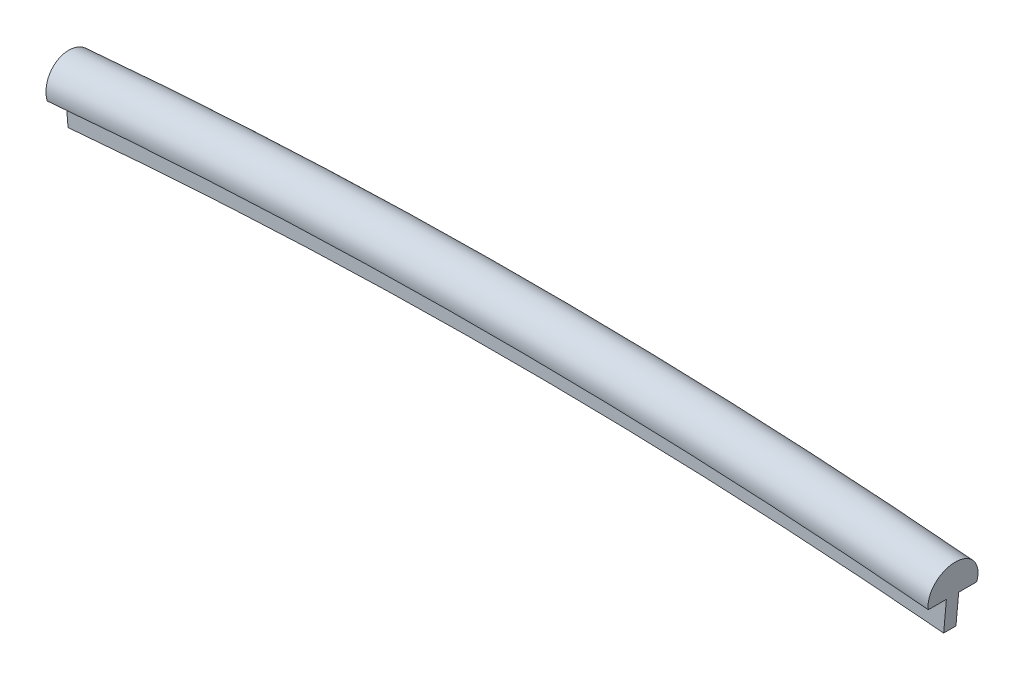
ISO-10303-21;
HEADER;
FILE_DESCRIPTION(('STEP AP214'),'2;1');
FILE_NAME('part.step','',(''),(''),'','','');
FILE_SCHEMA(('AUTOMOTIVE_DESIGN { 1 0 10303 214 1 1 1 1 }'));
ENDSEC;
DATA;
#1=APPLICATION_CONTEXT('core data for automotive mechanical design processes');
#2=APPLICATION_PROTOCOL_DEFINITION('international standard','automotive_design',2000,#1);
#3=PRODUCT_CONTEXT('',#1,'mechanical');
#4=PRODUCT('Part','Part','',(#3));
#5=PRODUCT_RELATED_PRODUCT_CATEGORY('part','',(#4));
#6=PRODUCT_DEFINITION_FORMATION('','',#4);
#7=PRODUCT_DEFINITION_CONTEXT('part definition',#1,'design');
#8=PRODUCT_DEFINITION('design','',#6,#7);
#9=PRODUCT_DEFINITION_SHAPE('','',#8);
#10=(LENGTH_UNIT() NAMED_UNIT(*) SI_UNIT(.MILLI.,.METRE.));
#11=(NAMED_UNIT(*) PLANE_ANGLE_UNIT() SI_UNIT($,.RADIAN.));
#12=(NAMED_UNIT(*) SI_UNIT($,.STERADIAN.) SOLID_ANGLE_UNIT());
#13=UNCERTAINTY_MEASURE_WITH_UNIT(LENGTH_MEASURE(1.E-05),#10,'distance_accuracy_value','');
#14=(GEOMETRIC_REPRESENTATION_CONTEXT(3) GLOBAL_UNCERTAINTY_ASSIGNED_CONTEXT((#13)) GLOBAL_UNIT_ASSIGNED_CONTEXT((#10,
#11,#12)) REPRESENTATION_CONTEXT('',''));
#15=CARTESIAN_POINT('',(0.,0.,0.));
#16=DIRECTION('',(0.,0.,1.));
#17=DIRECTION('',(1.,0.,0.));
#18=AXIS2_PLACEMENT_3D('',#15,#16,#17);
#19=CARTESIAN_POINT('',(0.,0.,70.5976415970385));
#20=DIRECTION('',(0.,0.,1.));
#21=DIRECTION('',(1.,0.,0.));
#22=AXIS2_PLACEMENT_3D('',#19,#20,#21);
#23=CYLINDRICAL_SURFACE('',#22,241.3);
#24=CARTESIAN_POINT('',(0.,0.,1.18));
#25=DIRECTION('',(0.,0.,1.));
#26=DIRECTION('',(1.,0.,0.));
#27=AXIS2_PLACEMENT_3D('',#24,#25,#26);
#28=CIRCLE('',#27,241.3);
#29=CARTESIAN_POINT('',(21.5114225884629,240.339236701419,1.18));
#30=VERTEX_POINT('',#29);
#31=CARTESIAN_POINT('',(-21.5114225884629,240.339236701419,1.18));
#32=VERTEX_POINT('',#31);
#33=EDGE_CURVE('E11',#30,#32,#28,.T.);
#34=ORIENTED_EDGE('',*,*,#33,.T.);
#35=DIRECTION('',(0.,0.,-1.));
#36=VECTOR('',#35,1.);
#37=CARTESIAN_POINT('',(-21.5114225884629,240.339236701419,1.18));
#38=LINE('',#37,#36);
#39=CARTESIAN_POINT('',(-21.5114225884629,240.339236701419,0.3));
#40=VERTEX_POINT('',#39);
#41=EDGE_CURVE('E103',#32,#40,#38,.T.);
#42=ORIENTED_EDGE('',*,*,#41,.T.);
#43=CARTESIAN_POINT('',(0.,0.,0.299999999999995));
#44=DIRECTION('',(0.,0.,1.));
#45=DIRECTION('',(1.,0.,0.));
#46=AXIS2_PLACEMENT_3D('',#43,#44,#45);
#47=CIRCLE('',#46,241.3);
#48=CARTESIAN_POINT('',(21.5114225884629,240.339236701419,0.3));
#49=VERTEX_POINT('',#48);
#50=EDGE_CURVE('E85',#49,#40,#47,.T.);
#51=ORIENTED_EDGE('',*,*,#50,.F.);
#52=DIRECTION('',(0.,0.,-1.));
#53=VECTOR('',#52,1.);
#54=CARTESIAN_POINT('',(21.5114225884629,240.339236701419,1.18));
#55=LINE('',#54,#53);
#56=EDGE_CURVE('E117',#30,#49,#55,.T.);
#57=ORIENTED_EDGE('',*,*,#56,.F.);
#58=EDGE_LOOP('',(#34,#42,#51,#57));
#59=FACE_BOUND('',#58,.T.);
#60=ADVANCED_FACE('F33',(#59),#23,.F.);
#61=CARTESIAN_POINT('',(0.,0.,0.));
#62=DIRECTION('',(0.,0.,1.));
#63=DIRECTION('',(1.,0.,0.));
#64=AXIS2_PLACEMENT_3D('',#61,#62,#63);
#65=TOROIDAL_SURFACE('',#64,241.586013989906,1.21416802890791);
#66=CARTESIAN_POINT('',(0.,0.,-1.18));
#67=DIRECTION('',(0.,0.,1.));
#68=DIRECTION('',(1.,0.,0.));
#69=AXIS2_PLACEMENT_3D('',#66,#67,#68);
#70=CIRCLE('',#69,241.3);
#71=CARTESIAN_POINT('',(21.5114225884629,240.339236701419,-1.18));
#72=VERTEX_POINT('',#71);
#73=CARTESIAN_POINT('',(-21.5114225884629,240.339236701419,-1.18));
#74=VERTEX_POINT('',#73);
#75=EDGE_CURVE('E41',#72,#74,#70,.T.);
#76=ORIENTED_EDGE('',*,*,#75,.T.);
#77=CARTESIAN_POINT('',(-21.5369201757115,240.624111894208,0.));
#78=DIRECTION('',(0.996018386661495,0.0891480422232197,0.));
#79=DIRECTION('',(0.,0.,1.));
#80=AXIS2_PLACEMENT_3D('',#77,#78,#79);
#81=CIRCLE('',#80,1.21416802890791);
#82=EDGE_CURVE('E115',#74,#32,#81,.T.);
#83=ORIENTED_EDGE('',*,*,#82,.T.);
#84=ORIENTED_EDGE('',*,*,#33,.F.);
#85=CARTESIAN_POINT('',(21.5369201757115,240.624111894208,0.));
#86=DIRECTION('',(0.996018386661495,-0.0891480422232197,0.));
#87=DIRECTION('',(0.,0.,1.));
#88=AXIS2_PLACEMENT_3D('',#85,#86,#87);
#89=CIRCLE('',#88,1.21416802890791);
#90=EDGE_CURVE('E97',#72,#30,#89,.T.);
#91=ORIENTED_EDGE('',*,*,#90,.F.);
#92=EDGE_LOOP('',(#76,#83,#84,#91));
#93=FACE_BOUND('',#92,.T.);
#94=ADVANCED_FACE('F35',(#93),#65,.T.);
#95=CARTESIAN_POINT('',(0.,0.,70.5976415970385));
#96=DIRECTION('',(0.,0.,1.));
#97=DIRECTION('',(1.,0.,0.));
#98=AXIS2_PLACEMENT_3D('',#95,#96,#97);
#99=CYLINDRICAL_SURFACE('',#98,241.3);
#100=CARTESIAN_POINT('',(0.,0.,-0.299999999999995));
#101=DIRECTION('',(0.,0.,1.));
#102=DIRECTION('',(1.,0.,0.));
#103=AXIS2_PLACEMENT_3D('',#100,#101,#102);
#104=CIRCLE('',#103,241.3);
#105=CARTESIAN_POINT('',(21.5114225884629,240.339236701419,-0.3));
#106=VERTEX_POINT('',#105);
#107=CARTESIAN_POINT('',(-21.5114225884629,240.339236701419,-0.3));
#108=VERTEX_POINT('',#107);
#109=EDGE_CURVE('E132',#106,#108,#104,.T.);
#110=ORIENTED_EDGE('',*,*,#109,.T.);
#111=DIRECTION('',(0.,0.,-1.));
#112=VECTOR('',#111,1.);
#113=CARTESIAN_POINT('',(-21.5114225884629,240.339236701419,-0.3));
#114=LINE('',#113,#112);
#115=EDGE_CURVE('E113',#108,#74,#114,.T.);
#116=ORIENTED_EDGE('',*,*,#115,.T.);
#117=ORIENTED_EDGE('',*,*,#75,.F.);
#118=DIRECTION('',(0.,0.,-1.));
#119=VECTOR('',#118,1.);
#120=CARTESIAN_POINT('',(21.5114225884629,240.339236701419,-0.3));
#121=LINE('',#120,#119);
#122=EDGE_CURVE('E125',#106,#72,#121,.T.);
#123=ORIENTED_EDGE('',*,*,#122,.F.);
#124=EDGE_LOOP('',(#110,#116,#117,#123));
#125=FACE_BOUND('',#124,.T.);
#126=ADVANCED_FACE('F134',(#125),#99,.F.);
#127=CARTESIAN_POINT('',(21.3777005251281,238.845209121426,-0.3));
#128=DIRECTION('',(0.,0.,1.));
#129=DIRECTION('',(1.,0.,0.));
#130=AXIS2_PLACEMENT_3D('',#127,#128,#129);
#131=PLANE('',#130);
#132=CARTESIAN_POINT('',(0.,0.,-0.299999999999995));
#133=DIRECTION('',(0.,0.,1.));
#134=DIRECTION('',(1.,0.,0.));
#135=AXIS2_PLACEMENT_3D('',#132,#133,#134);
#136=CIRCLE('',#135,239.8);
#137=CARTESIAN_POINT('',(21.3777005251281,238.845209121426,-0.3));
#138=VERTEX_POINT('',#137);
#139=CARTESIAN_POINT('',(-21.3777005251281,238.845209121426,-0.3));
#140=VERTEX_POINT('',#139);
#141=EDGE_CURVE('E129',#138,#140,#136,.T.);
#142=ORIENTED_EDGE('',*,*,#141,.T.);
#143=DIRECTION('',(-0.0891480422232197,0.996018386661495,0.));
#144=VECTOR('',#143,1.);
#145=CARTESIAN_POINT('',(-21.3777005251281,238.845209121426,-0.3));
#146=LINE('',#145,#144);
#147=EDGE_CURVE('E110',#140,#108,#146,.T.);
#148=ORIENTED_EDGE('',*,*,#147,.T.);
#149=ORIENTED_EDGE('',*,*,#109,.F.);
#150=DIRECTION('',(0.0891480422232197,0.996018386661495,0.));
#151=VECTOR('',#150,1.);
#152=CARTESIAN_POINT('',(21.3777005251281,238.845209121426,-0.3));
#153=LINE('',#152,#151);
#154=EDGE_CURVE('E122',#138,#106,#153,.T.);
#155=ORIENTED_EDGE('',*,*,#154,.F.);
#156=EDGE_LOOP('',(#142,#148,#149,#155));
#157=FACE_BOUND('',#156,.T.);
#158=ADVANCED_FACE('F136',(#157),#131,.F.);
#159=CARTESIAN_POINT('',(0.,0.,70.5976415970385));
#160=DIRECTION('',(0.,0.,1.));
#161=DIRECTION('',(1.,0.,0.));
#162=AXIS2_PLACEMENT_3D('',#159,#160,#161);
#163=CYLINDRICAL_SURFACE('',#162,239.8);
#164=CARTESIAN_POINT('',(0.,0.,0.299999999999995));
#165=DIRECTION('',(0.,0.,1.));
#166=DIRECTION('',(1.,0.,0.));
#167=AXIS2_PLACEMENT_3D('',#164,#165,#166);
#168=CIRCLE('',#167,239.8);
#169=CARTESIAN_POINT('',(21.3777005251281,238.845209121426,0.3));
#170=VERTEX_POINT('',#169);
#171=CARTESIAN_POINT('',(-21.3777005251281,238.845209121426,0.3));
#172=VERTEX_POINT('',#171);
#173=EDGE_CURVE('E96',#170,#172,#168,.T.);
#174=ORIENTED_EDGE('',*,*,#173,.T.);
#175=DIRECTION('',(0.,0.,-1.));
#176=VECTOR('',#175,1.);
#177=CARTESIAN_POINT('',(-21.3777005251281,238.845209121426,0.));
#178=LINE('',#177,#176);
#179=EDGE_CURVE('E105',#172,#140,#178,.T.);
#180=ORIENTED_EDGE('',*,*,#179,.T.);
#181=ORIENTED_EDGE('',*,*,#141,.F.);
#182=DIRECTION('',(0.,0.,-1.));
#183=VECTOR('',#182,1.);
#184=CARTESIAN_POINT('',(21.3777005251281,238.845209121426,0.));
#185=LINE('',#184,#183);
#186=EDGE_CURVE('E120',#170,#138,#185,.T.);
#187=ORIENTED_EDGE('',*,*,#186,.F.);
#188=EDGE_LOOP('',(#174,#180,#181,#187));
#189=FACE_BOUND('',#188,.T.);
#190=ADVANCED_FACE('F141',(#189),#163,.F.);
#191=CARTESIAN_POINT('',(21.3777005251281,238.845209121426,0.3));
#192=DIRECTION('',(0.,0.,-1.));
#193=DIRECTION('',(-1.,0.,0.));
#194=AXIS2_PLACEMENT_3D('',#191,#192,#193);
#195=PLANE('',#194);
#196=DIRECTION('',(-0.0891480422232197,-0.996018386661495,0.));
#197=VECTOR('',#196,1.);
#198=CARTESIAN_POINT('',(21.3777005251281,238.845209121426,0.3));
#199=LINE('',#198,#197);
#200=EDGE_CURVE('E91',#49,#170,#199,.T.);
#201=ORIENTED_EDGE('',*,*,#200,.F.);
#202=ORIENTED_EDGE('',*,*,#50,.T.);
#203=DIRECTION('',(0.0891480422232197,-0.996018386661495,0.));
#204=VECTOR('',#203,1.);
#205=CARTESIAN_POINT('',(-21.3777005251281,238.845209121426,0.3));
#206=LINE('',#205,#204);
#207=EDGE_CURVE('E88',#40,#172,#206,.T.);
#208=ORIENTED_EDGE('',*,*,#207,.T.);
#209=ORIENTED_EDGE('',*,*,#173,.F.);
#210=EDGE_LOOP('',(#201,#202,#208,#209));
#211=FACE_BOUND('',#210,.T.);
#212=ADVANCED_FACE('F87',(#211),#195,.F.);
#213=CARTESIAN_POINT('',(21.5369201757115,240.624111894208,0.));
#214=DIRECTION('',(-0.996018386661495,0.0891480422232197,0.));
#215=DIRECTION('',(0.,0.,1.));
#216=AXIS2_PLACEMENT_3D('',#213,#214,#215);
#217=PLANE('',#216);
#218=ORIENTED_EDGE('',*,*,#56,.T.);
#219=ORIENTED_EDGE('',*,*,#200,.T.);
#220=ORIENTED_EDGE('',*,*,#186,.T.);
#221=ORIENTED_EDGE('',*,*,#154,.T.);
#222=ORIENTED_EDGE('',*,*,#122,.T.);
#223=ORIENTED_EDGE('',*,*,#90,.T.);
#224=EDGE_LOOP('',(#218,#219,#220,#221,#222,#223));
#225=FACE_BOUND('',#224,.T.);
#226=ADVANCED_FACE('F143',(#225),#217,.F.);
#227=CARTESIAN_POINT('',(-21.5369201757115,240.624111894208,0.));
#228=DIRECTION('',(-0.996018386661495,-0.0891480422232197,0.));
#229=DIRECTION('',(0.,0.,1.));
#230=AXIS2_PLACEMENT_3D('',#227,#228,#229);
#231=PLANE('',#230);
#232=ORIENTED_EDGE('',*,*,#41,.F.);
#233=ORIENTED_EDGE('',*,*,#82,.F.);
#234=ORIENTED_EDGE('',*,*,#115,.F.);
#235=ORIENTED_EDGE('',*,*,#147,.F.);
#236=ORIENTED_EDGE('',*,*,#179,.F.);
#237=ORIENTED_EDGE('',*,*,#207,.F.);
#238=EDGE_LOOP('',(#232,#233,#234,#235,#236,#237));
#239=FACE_BOUND('',#238,.T.);
#240=ADVANCED_FACE('F101',(#239),#231,.T.);
#241=CLOSED_SHELL('',(#60,#94,#126,#158,#190,#212,#226,#240));
#242=MANIFOLD_SOLID_BREP('B2',#241);
#243=ADVANCED_BREP_SHAPE_REPRESENTATION('',(#18,#242),#14);
#244=SHAPE_DEFINITION_REPRESENTATION(#9,#243);
ENDSEC;
END-ISO-10303-21;
